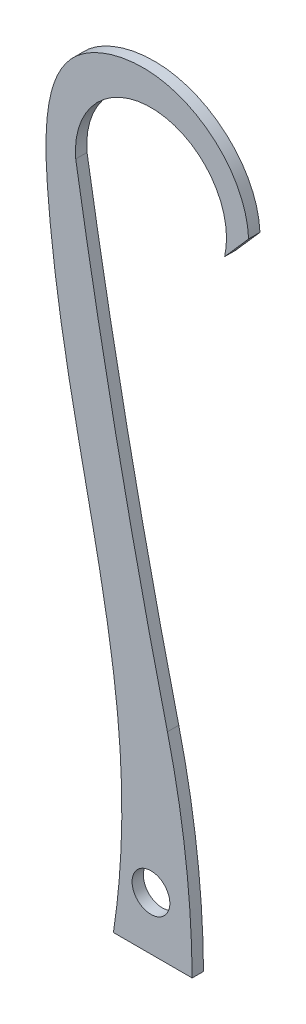
ISO-10303-21;
HEADER;
FILE_DESCRIPTION(('STEP AP214'),'2;1');
FILE_NAME('part.step','',(''),(''),'','','');
FILE_SCHEMA(('AUTOMOTIVE_DESIGN { 1 0 10303 214 1 1 1 1 }'));
ENDSEC;
DATA;
#1=APPLICATION_CONTEXT('core data for automotive mechanical design processes');
#2=APPLICATION_PROTOCOL_DEFINITION('international standard','automotive_design',2000,#1);
#3=PRODUCT_CONTEXT('',#1,'mechanical');
#4=PRODUCT('Part','Part','',(#3));
#5=PRODUCT_RELATED_PRODUCT_CATEGORY('part','',(#4));
#6=PRODUCT_DEFINITION_FORMATION('','',#4);
#7=PRODUCT_DEFINITION_CONTEXT('part definition',#1,'design');
#8=PRODUCT_DEFINITION('design','',#6,#7);
#9=PRODUCT_DEFINITION_SHAPE('','',#8);
#10=(LENGTH_UNIT() NAMED_UNIT(*) SI_UNIT(.MILLI.,.METRE.));
#11=(NAMED_UNIT(*) PLANE_ANGLE_UNIT() SI_UNIT($,.RADIAN.));
#12=(NAMED_UNIT(*) SI_UNIT($,.STERADIAN.) SOLID_ANGLE_UNIT());
#13=UNCERTAINTY_MEASURE_WITH_UNIT(LENGTH_MEASURE(1.E-05),#10,'distance_accuracy_value','');
#14=(GEOMETRIC_REPRESENTATION_CONTEXT(3) GLOBAL_UNCERTAINTY_ASSIGNED_CONTEXT((#13)) GLOBAL_UNIT_ASSIGNED_CONTEXT((#10,
#11,#12)) REPRESENTATION_CONTEXT('',''));
#15=CARTESIAN_POINT('',(0.,0.,0.));
#16=DIRECTION('',(0.,0.,1.));
#17=DIRECTION('',(1.,0.,0.));
#18=AXIS2_PLACEMENT_3D('',#15,#16,#17);
#19=CARTESIAN_POINT('',(-50.8,0.,7.62));
#20=DIRECTION('',(0.,0.,1.));
#21=DIRECTION('',(1.,0.,0.));
#22=AXIS2_PLACEMENT_3D('',#19,#20,#21);
#23=PLANE('',#22);
#24=DIRECTION('',(1.,0.,0.));
#25=VECTOR('',#24,1.);
#26=CARTESIAN_POINT('',(-76.0421008531231,-442.292607066979,7.62));
#27=LINE('',#26,#25);
#28=CARTESIAN_POINT('',(-76.0421008531231,-442.292607066979,7.62));
#29=VERTEX_POINT('',#28);
#30=CARTESIAN_POINT('',(-23.088177417922,-442.292607066979,7.62));
#31=VERTEX_POINT('',#30);
#32=EDGE_CURVE('E111',#29,#31,#27,.T.);
#33=ORIENTED_EDGE('',*,*,#32,.T.);
#34=CARTESIAN_POINT('',(-612.354255660292,-446.343216015472,7.62));
#35=DIRECTION('',(0.,0.,1.));
#36=DIRECTION('',(1.,0.,0.));
#37=AXIS2_PLACEMENT_3D('',#34,#35,#36);
#38=CIRCLE('',#37,589.279999999998);
#39=CARTESIAN_POINT('',(-39.7325932240478,-307.219709343348,7.62));
#40=VERTEX_POINT('',#39);
#41=EDGE_CURVE('E11',#31,#40,#38,.T.);
#42=ORIENTED_EDGE('',*,*,#41,.T.);
#43=CARTESIAN_POINT('',(-23.088177417922,-373.348830577234,7.62));
#44=CARTESIAN_POINT('',(-70.6769147288869,-190.640134145218,7.62));
#45=CARTESIAN_POINT('',(-101.401950785355,-4.48135880247412,7.62));
#46=B_SPLINE_CURVE_WITH_KNOTS('',2,(#43,#44,#45),.UNSPECIFIED.,.F.,.F.,(3,3),(0.,1.),.UNSPECIFIED.);
#47=CARTESIAN_POINT('',(-101.401950785355,-4.48135880247412,7.62));
#48=VERTEX_POINT('',#47);
#49=EDGE_CURVE('E90',#40,#48,#46,.T.);
#50=ORIENTED_EDGE('',*,*,#49,.T.);
#51=CARTESIAN_POINT('',(-50.8,0.,7.62));
#52=DIRECTION('',(0.,0.,-1.));
#53=DIRECTION('',(1.,0.,0.));
#54=AXIS2_PLACEMENT_3D('',#51,#52,#53);
#55=CIRCLE('',#54,50.8);
#56=CARTESIAN_POINT('',(-1.27479101518192,-11.3090085776824,7.62));
#57=VERTEX_POINT('',#56);
#58=EDGE_CURVE('E84',#48,#57,#55,.T.);
#59=ORIENTED_EDGE('',*,*,#58,.T.);
#60=DIRECTION('',(0.659376632907494,0.751812779869814,0.));
#61=VECTOR('',#60,1.);
#62=CARTESIAN_POINT('',(-1.27479101518192,-11.3090085776824,7.62));
#63=LINE('',#62,#61);
#64=CARTESIAN_POINT('',(14.871495785328,7.10078054471996,7.62));
#65=VERTEX_POINT('',#64);
#66=EDGE_CURVE('E88',#57,#65,#63,.T.);
#67=ORIENTED_EDGE('',*,*,#66,.T.);
#68=CARTESIAN_POINT('',(14.871495785328,7.10078054471996,7.62));
#69=CARTESIAN_POINT('',(13.3752906065778,41.3112745317411,7.62));
#70=CARTESIAN_POINT('',(-33.0887862457221,83.5527718009011,7.62));
#71=CARTESIAN_POINT('',(-124.395877584324,55.9187089755483,7.62));
#72=CARTESIAN_POINT('',(-118.692404940875,-164.860535273841,7.62));
#73=CARTESIAN_POINT('',(-53.1629988926886,-292.737862096376,7.62));
#74=CARTESIAN_POINT('',(-76.0421008531231,-442.292607066979,7.62));
#75=B_SPLINE_CURVE_WITH_KNOTS('',3,(#68,#69,#70,#71,#72,#73,#74),.UNSPECIFIED.,.F.,.F.,(4,1,1,1,
4),(0.,0.149570105909908,0.231035949765627,0.3764114712965,1.),.UNSPECIFIED.);
#76=EDGE_CURVE('E109',#65,#29,#75,.T.);
#77=ORIENTED_EDGE('',*,*,#76,.T.);
#78=EDGE_LOOP('',(#33,#42,#50,#59,#67,#77));
#79=FACE_BOUND('',#78,.T.);
#80=CARTESIAN_POINT('',(-50.7999999999999,-406.4,7.62));
#81=DIRECTION('',(0.,0.,1.));
#82=DIRECTION('',(1.,0.,0.));
#83=AXIS2_PLACEMENT_3D('',#80,#81,#82);
#84=CIRCLE('',#83,12.7);
#85=CARTESIAN_POINT('',(-38.0999999999999,-406.4,7.62));
#86=VERTEX_POINT('',#85);
#87=EDGE_CURVE('E157',#86,#86,#84,.T.);
#88=ORIENTED_EDGE('',*,*,#87,.F.);
#89=EDGE_LOOP('',(#88));
#90=FACE_BOUND('',#89,.T.);
#91=ADVANCED_FACE('F35',(#79,#90),#23,.T.);
#92=CARTESIAN_POINT('',(-50.8,0.,0.));
#93=DIRECTION('',(0.,0.,1.));
#94=DIRECTION('',(1.,0.,0.));
#95=AXIS2_PLACEMENT_3D('',#92,#93,#94);
#96=PLANE('',#95);
#97=CARTESIAN_POINT('',(-23.088177417922,-373.348830577234,0.));
#98=CARTESIAN_POINT('',(-70.6769147288869,-190.640134145218,0.));
#99=CARTESIAN_POINT('',(-101.401950785355,-4.48135880247412,0.));
#100=B_SPLINE_CURVE_WITH_KNOTS('',2,(#97,#98,#99),.UNSPECIFIED.,.F.,.F.,(3,3),(0.,1.),.UNSPECIFIED.);
#101=CARTESIAN_POINT('',(-39.7325932240478,-307.219709343348,0.));
#102=VERTEX_POINT('',#101);
#103=CARTESIAN_POINT('',(-101.401950785355,-4.48135880247412,0.));
#104=VERTEX_POINT('',#103);
#105=EDGE_CURVE('E94',#102,#104,#100,.T.);
#106=ORIENTED_EDGE('',*,*,#105,.F.);
#107=CARTESIAN_POINT('',(-612.354255660292,-446.343216015472,0.));
#108=DIRECTION('',(0.,0.,1.));
#109=DIRECTION('',(1.,0.,0.));
#110=AXIS2_PLACEMENT_3D('',#107,#108,#109);
#111=CIRCLE('',#110,589.279999999998);
#112=CARTESIAN_POINT('',(-23.088177417922,-442.292607066979,0.));
#113=VERTEX_POINT('',#112);
#114=EDGE_CURVE('E43',#102,#113,#111,.F.);
#115=ORIENTED_EDGE('',*,*,#114,.T.);
#116=DIRECTION('',(1.,0.,0.));
#117=VECTOR('',#116,1.);
#118=CARTESIAN_POINT('',(-76.0421008531231,-442.292607066979,0.));
#119=LINE('',#118,#117);
#120=CARTESIAN_POINT('',(-76.0421008531231,-442.292607066979,0.));
#121=VERTEX_POINT('',#120);
#122=EDGE_CURVE('E163',#121,#113,#119,.T.);
#123=ORIENTED_EDGE('',*,*,#122,.F.);
#124=CARTESIAN_POINT('',(14.871495785328,7.10078054471996,0.));
#125=CARTESIAN_POINT('',(13.3752906065778,41.3112745317411,0.));
#126=CARTESIAN_POINT('',(-33.0887862457221,83.5527718009011,0.));
#127=CARTESIAN_POINT('',(-124.395877584324,55.9187089755483,0.));
#128=CARTESIAN_POINT('',(-118.692404940875,-164.860535273841,0.));
#129=CARTESIAN_POINT('',(-53.1629988926886,-292.737862096376,0.));
#130=CARTESIAN_POINT('',(-76.0421008531231,-442.292607066979,0.));
#131=B_SPLINE_CURVE_WITH_KNOTS('',3,(#124,#125,#126,#127,#128,#129,#130),.UNSPECIFIED.,.F.,.F.,
(4,1,1,1,4),(0.,0.149570105909908,0.231035949765627,0.3764114712965,1.),.UNSPECIFIED.);
#132=CARTESIAN_POINT('',(14.871495785328,7.10078054471996,0.));
#133=VERTEX_POINT('',#132);
#134=EDGE_CURVE('E159',#133,#121,#131,.T.);
#135=ORIENTED_EDGE('',*,*,#134,.F.);
#136=DIRECTION('',(0.659376632907494,0.751812779869814,0.));
#137=VECTOR('',#136,1.);
#138=CARTESIAN_POINT('',(-1.27479101518192,-11.3090085776824,0.));
#139=LINE('',#138,#137);
#140=CARTESIAN_POINT('',(-1.27479101518192,-11.3090085776824,0.));
#141=VERTEX_POINT('',#140);
#142=EDGE_CURVE('E156',#141,#133,#139,.T.);
#143=ORIENTED_EDGE('',*,*,#142,.F.);
#144=CARTESIAN_POINT('',(-50.8,0.,0.));
#145=DIRECTION('',(0.,0.,-1.));
#146=DIRECTION('',(-1.,0.,0.));
#147=AXIS2_PLACEMENT_3D('',#144,#145,#146);
#148=CIRCLE('',#147,50.8);
#149=EDGE_CURVE('E100',#104,#141,#148,.T.);
#150=ORIENTED_EDGE('',*,*,#149,.F.);
#151=EDGE_LOOP('',(#106,#115,#123,#135,#143,#150));
#152=FACE_BOUND('',#151,.T.);
#153=CARTESIAN_POINT('',(-50.7999999999999,-406.4,0.));
#154=DIRECTION('',(0.,0.,1.));
#155=DIRECTION('',(1.,0.,0.));
#156=AXIS2_PLACEMENT_3D('',#153,#154,#155);
#157=CIRCLE('',#156,12.7);
#158=CARTESIAN_POINT('',(-38.0999999999999,-406.4,0.));
#159=VERTEX_POINT('',#158);
#160=EDGE_CURVE('E202',#159,#159,#157,.T.);
#161=ORIENTED_EDGE('',*,*,#160,.T.);
#162=EDGE_LOOP('',(#161));
#163=FACE_BOUND('',#162,.T.);
#164=ADVANCED_FACE('F132',(#152,#163),#96,.F.);
#165=CARTESIAN_POINT('',(-50.8,0.,7.62));
#166=DIRECTION('',(0.,0.,-1.));
#167=DIRECTION('',(-1.,0.,0.));
#168=AXIS2_PLACEMENT_3D('',#165,#166,#167);
#169=CYLINDRICAL_SURFACE('',#168,50.8);
#170=ORIENTED_EDGE('',*,*,#149,.T.);
#171=DIRECTION('',(0.,0.,-1.));
#172=VECTOR('',#171,1.);
#173=CARTESIAN_POINT('',(-1.27479101518192,-11.3090085776824,7.62));
#174=LINE('',#173,#172);
#175=EDGE_CURVE('E97',#57,#141,#174,.T.);
#176=ORIENTED_EDGE('',*,*,#175,.F.);
#177=ORIENTED_EDGE('',*,*,#58,.F.);
#178=DIRECTION('',(0.,0.,-1.));
#179=VECTOR('',#178,1.);
#180=CARTESIAN_POINT('',(-101.401950785355,-4.48135880247412,7.62));
#181=LINE('',#180,#179);
#182=EDGE_CURVE('E151',#48,#104,#181,.T.);
#183=ORIENTED_EDGE('',*,*,#182,.T.);
#184=EDGE_LOOP('',(#170,#176,#177,#183));
#185=FACE_BOUND('',#184,.T.);
#186=ADVANCED_FACE('F98',(#185),#169,.F.);
#187=CARTESIAN_POINT('',(-1.27479101518192,-11.3090085776824,7.62));
#188=DIRECTION('',(-0.751812779869813,0.659376632907493,0.));
#189=DIRECTION('',(-0.659376632907493,-0.751812779869814,0.));
#190=AXIS2_PLACEMENT_3D('',#187,#188,#189);
#191=PLANE('',#190);
#192=ORIENTED_EDGE('',*,*,#142,.T.);
#193=DIRECTION('',(0.,0.,-1.));
#194=VECTOR('',#193,1.);
#195=CARTESIAN_POINT('',(14.871495785328,7.10078054471996,7.62));
#196=LINE('',#195,#194);
#197=EDGE_CURVE('E104',#65,#133,#196,.T.);
#198=ORIENTED_EDGE('',*,*,#197,.F.);
#199=ORIENTED_EDGE('',*,*,#66,.F.);
#200=ORIENTED_EDGE('',*,*,#175,.T.);
#201=EDGE_LOOP('',(#192,#198,#199,#200));
#202=FACE_BOUND('',#201,.T.);
#203=ADVANCED_FACE('F106',(#202),#191,.F.);
#204=DIRECTION('',(0.,0.,-1.));
#205=VECTOR('',#204,1.);
#206=SURFACE_OF_LINEAR_EXTRUSION('',#75,#205);
#207=ORIENTED_EDGE('',*,*,#134,.T.);
#208=DIRECTION('',(0.,0.,-1.));
#209=VECTOR('',#208,1.);
#210=CARTESIAN_POINT('',(-76.0421008531231,-442.292607066979,7.62));
#211=LINE('',#210,#209);
#212=EDGE_CURVE('E178',#29,#121,#211,.T.);
#213=ORIENTED_EDGE('',*,*,#212,.F.);
#214=ORIENTED_EDGE('',*,*,#76,.F.);
#215=ORIENTED_EDGE('',*,*,#197,.T.);
#216=EDGE_LOOP('',(#207,#213,#214,#215));
#217=FACE_BOUND('',#216,.T.);
#218=ADVANCED_FACE('F123',(#217),#206,.F.);
#219=CARTESIAN_POINT('',(-76.0421008531231,-442.292607066979,7.62));
#220=DIRECTION('',(0.,1.,0.));
#221=DIRECTION('',(0.,0.,1.));
#222=AXIS2_PLACEMENT_3D('',#219,#220,#221);
#223=PLANE('',#222);
#224=ORIENTED_EDGE('',*,*,#122,.T.);
#225=DIRECTION('',(0.,0.,-1.));
#226=VECTOR('',#225,1.);
#227=CARTESIAN_POINT('',(-23.088177417922,-442.292607066979,7.62));
#228=LINE('',#227,#226);
#229=EDGE_CURVE('E176',#31,#113,#228,.T.);
#230=ORIENTED_EDGE('',*,*,#229,.F.);
#231=ORIENTED_EDGE('',*,*,#32,.F.);
#232=ORIENTED_EDGE('',*,*,#212,.T.);
#233=EDGE_LOOP('',(#224,#230,#231,#232));
#234=FACE_BOUND('',#233,.T.);
#235=ADVANCED_FACE('F127',(#234),#223,.F.);
#236=DIRECTION('',(0.,0.,-1.));
#237=VECTOR('',#236,1.);
#238=SURFACE_OF_LINEAR_EXTRUSION('',#46,#237);
#239=ORIENTED_EDGE('',*,*,#49,.F.);
#240=DIRECTION('',(0.,0.,-1.));
#241=VECTOR('',#240,1.);
#242=CARTESIAN_POINT('',(-39.7325932240478,-307.219709343348,7.62));
#243=LINE('',#242,#241);
#244=EDGE_CURVE('E103',#40,#102,#243,.T.);
#245=ORIENTED_EDGE('',*,*,#244,.T.);
#246=ORIENTED_EDGE('',*,*,#105,.T.);
#247=ORIENTED_EDGE('',*,*,#182,.F.);
#248=EDGE_LOOP('',(#239,#245,#246,#247));
#249=FACE_BOUND('',#248,.T.);
#250=ADVANCED_FACE('F144',(#249),#238,.F.);
#251=CARTESIAN_POINT('',(-50.7999999999999,-406.4,7.62));
#252=DIRECTION('',(0.,0.,-1.));
#253=DIRECTION('',(-1.,0.,0.));
#254=AXIS2_PLACEMENT_3D('',#251,#252,#253);
#255=CYLINDRICAL_SURFACE('',#254,12.7);
#256=ORIENTED_EDGE('',*,*,#87,.T.);
#257=EDGE_LOOP('',(#256));
#258=FACE_BOUND('',#257,.T.);
#259=ORIENTED_EDGE('',*,*,#160,.F.);
#260=EDGE_LOOP('',(#259));
#261=FACE_BOUND('',#260,.T.);
#262=ADVANCED_FACE('F143',(#258,#261),#255,.F.);
#263=CARTESIAN_POINT('',(-612.354255660292,-446.343216015472,3.81));
#264=DIRECTION('',(0.,0.,-1.));
#265=DIRECTION('',(-1.,0.,0.));
#266=AXIS2_PLACEMENT_3D('',#263,#264,#265);
#267=CYLINDRICAL_SURFACE('',#266,589.279999999998);
#268=ORIENTED_EDGE('',*,*,#41,.F.);
#269=ORIENTED_EDGE('',*,*,#229,.T.);
#270=ORIENTED_EDGE('',*,*,#114,.F.);
#271=ORIENTED_EDGE('',*,*,#244,.F.);
#272=EDGE_LOOP('',(#268,#269,#270,#271));
#273=FACE_BOUND('',#272,.T.);
#274=ADVANCED_FACE('F37',(#273),#267,.T.);
#275=CLOSED_SHELL('',(#91,#164,#186,#203,#218,#235,#250,#262,#274));
#276=MANIFOLD_SOLID_BREP('B2',#275);
#277=ADVANCED_BREP_SHAPE_REPRESENTATION('',(#18,#276),#14);
#278=SHAPE_DEFINITION_REPRESENTATION(#9,#277);
ENDSEC;
END-ISO-10303-21;
